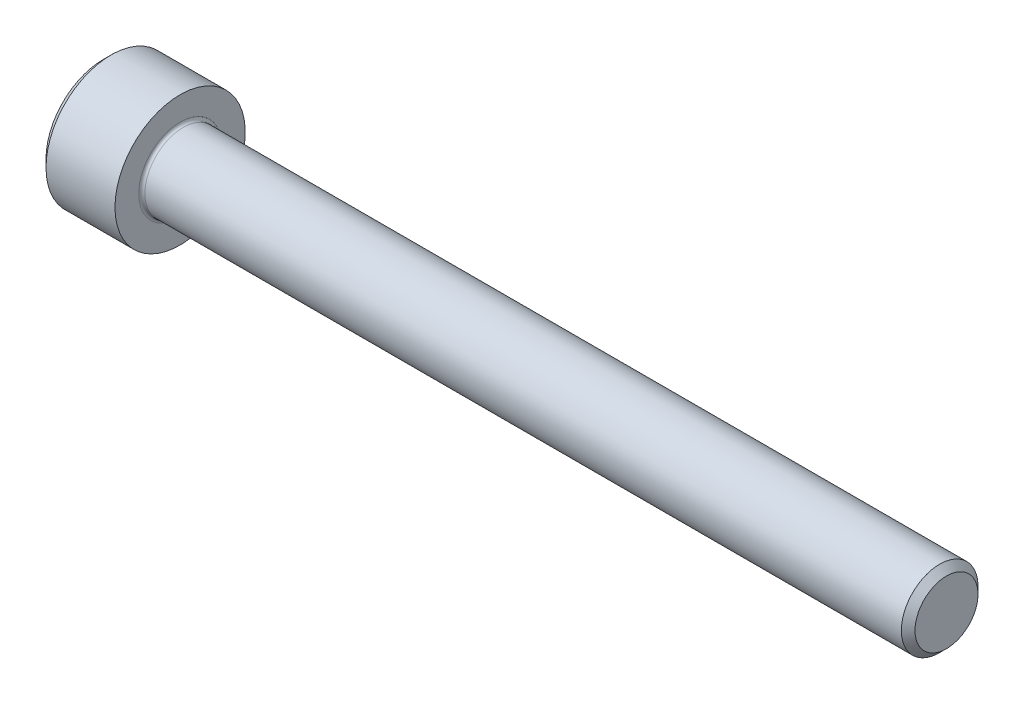
ISO-10303-21;
HEADER;
FILE_DESCRIPTION(('STEP AP214'),'2;1');
FILE_NAME('part.step','',(''),(''),'','','');
FILE_SCHEMA(('AUTOMOTIVE_DESIGN { 1 0 10303 214 1 1 1 1 }'));
ENDSEC;
DATA;
#1=APPLICATION_CONTEXT('core data for automotive mechanical design processes');
#2=APPLICATION_PROTOCOL_DEFINITION('international standard','automotive_design',2000,#1);
#3=PRODUCT_CONTEXT('',#1,'mechanical');
#4=PRODUCT('Part','Part','',(#3));
#5=PRODUCT_RELATED_PRODUCT_CATEGORY('part','',(#4));
#6=PRODUCT_DEFINITION_FORMATION('','',#4);
#7=PRODUCT_DEFINITION_CONTEXT('part definition',#1,'design');
#8=PRODUCT_DEFINITION('design','',#6,#7);
#9=PRODUCT_DEFINITION_SHAPE('','',#8);
#10=(LENGTH_UNIT() NAMED_UNIT(*) SI_UNIT(.MILLI.,.METRE.));
#11=(NAMED_UNIT(*) PLANE_ANGLE_UNIT() SI_UNIT($,.RADIAN.));
#12=(NAMED_UNIT(*) SI_UNIT($,.STERADIAN.) SOLID_ANGLE_UNIT());
#13=UNCERTAINTY_MEASURE_WITH_UNIT(LENGTH_MEASURE(1.E-05),#10,'distance_accuracy_value','');
#14=(GEOMETRIC_REPRESENTATION_CONTEXT(3) GLOBAL_UNCERTAINTY_ASSIGNED_CONTEXT((#13)) GLOBAL_UNIT_ASSIGNED_CONTEXT((#10,
#11,#12)) REPRESENTATION_CONTEXT('',''));
#15=CARTESIAN_POINT('',(0.,0.,0.));
#16=DIRECTION('',(0.,0.,1.));
#17=DIRECTION('',(1.,0.,0.));
#18=AXIS2_PLACEMENT_3D('',#15,#16,#17);
#19=CARTESIAN_POINT('',(0.,0.,0.));
#20=DIRECTION('',(-1.,0.,0.));
#21=DIRECTION('',(0.,0.,1.));
#22=AXIS2_PLACEMENT_3D('',#19,#20,#21);
#23=PLANE('',#22);
#24=DIRECTION('',(0.,-0.499999999999999,0.866025403784439));
#25=VECTOR('',#24,1.);
#26=CARTESIAN_POINT('',(0.,2.35789849937043,0.));
#27=LINE('',#26,#25);
#28=CARTESIAN_POINT('',(0.,2.35789849937043,0.));
#29=VERTEX_POINT('',#28);
#30=CARTESIAN_POINT('',(0.,1.17894924968522,2.042));
#31=VERTEX_POINT('',#30);
#32=EDGE_CURVE('E293',#29,#31,#27,.T.);
#33=ORIENTED_EDGE('',*,*,#32,.T.);
#34=DIRECTION('',(0.,1.,0.));
#35=VECTOR('',#34,1.);
#36=CARTESIAN_POINT('',(0.,-1.17894924968522,2.042));
#37=LINE('',#36,#35);
#38=CARTESIAN_POINT('',(0.,-1.17894924968522,2.042));
#39=VERTEX_POINT('',#38);
#40=EDGE_CURVE('E136',#39,#31,#37,.T.);
#41=ORIENTED_EDGE('',*,*,#40,.F.);
#42=DIRECTION('',(0.,-0.500000000000001,-0.866025403784438));
#43=VECTOR('',#42,1.);
#44=CARTESIAN_POINT('',(0.,-1.17894924968522,2.042));
#45=LINE('',#44,#43);
#46=CARTESIAN_POINT('',(0.,-2.35789849937043,0.));
#47=VERTEX_POINT('',#46);
#48=EDGE_CURVE('E298',#39,#47,#45,.T.);
#49=ORIENTED_EDGE('',*,*,#48,.T.);
#50=DIRECTION('',(0.,0.499999999999999,-0.866025403784439));
#51=VECTOR('',#50,1.);
#52=CARTESIAN_POINT('',(0.,-2.35789849937043,0.));
#53=LINE('',#52,#51);
#54=CARTESIAN_POINT('',(0.,-1.17894924968522,-2.042));
#55=VERTEX_POINT('',#54);
#56=EDGE_CURVE('E302',#47,#55,#53,.T.);
#57=ORIENTED_EDGE('',*,*,#56,.T.);
#58=DIRECTION('',(0.,-1.,0.));
#59=VECTOR('',#58,1.);
#60=CARTESIAN_POINT('',(0.,1.17894924968521,-2.042));
#61=LINE('',#60,#59);
#62=CARTESIAN_POINT('',(0.,1.17894924968521,-2.042));
#63=VERTEX_POINT('',#62);
#64=EDGE_CURVE('E306',#63,#55,#61,.T.);
#65=ORIENTED_EDGE('',*,*,#64,.F.);
#66=DIRECTION('',(0.,-0.500000000000001,-0.866025403784438));
#67=VECTOR('',#66,1.);
#68=CARTESIAN_POINT('',(0.,2.35789849937043,0.));
#69=LINE('',#68,#67);
#70=EDGE_CURVE('E131',#29,#63,#69,.T.);
#71=ORIENTED_EDGE('',*,*,#70,.F.);
#72=EDGE_LOOP('',(#33,#41,#49,#57,#65,#71));
#73=FACE_BOUND('',#72,.T.);
#74=CARTESIAN_POINT('',(0.,0.,0.));
#75=DIRECTION('',(-1.,0.,0.));
#76=DIRECTION('',(0.,0.,1.));
#77=AXIS2_PLACEMENT_3D('',#74,#75,#76);
#78=CIRCLE('',#77,3.75);
#79=CARTESIAN_POINT('',(0.,0.,3.75));
#80=VERTEX_POINT('',#79);
#81=EDGE_CURVE('E168',#80,#80,#78,.T.);
#82=ORIENTED_EDGE('',*,*,#81,.T.);
#83=EDGE_LOOP('',(#82));
#84=FACE_BOUND('',#83,.T.);
#85=ADVANCED_FACE('F41',(#73,#84),#23,.T.);
#86=CARTESIAN_POINT('',(0.,0.,0.));
#87=DIRECTION('',(1.,0.,0.));
#88=DIRECTION('',(0.,0.,-1.));
#89=AXIS2_PLACEMENT_3D('',#86,#87,#88);
#90=CONICAL_SURFACE('',#89,3.75,0.785398163397449);
#91=CARTESIAN_POINT('',(0.5,0.,0.));
#92=DIRECTION('',(-1.,0.,0.));
#93=DIRECTION('',(0.,0.,1.));
#94=AXIS2_PLACEMENT_3D('',#91,#92,#93);
#95=CIRCLE('',#94,4.25);
#96=CARTESIAN_POINT('',(0.5,0.,4.25));
#97=VERTEX_POINT('',#96);
#98=EDGE_CURVE('E164',#97,#97,#95,.T.);
#99=ORIENTED_EDGE('',*,*,#98,.T.);
#100=EDGE_LOOP('',(#99));
#101=FACE_BOUND('',#100,.T.);
#102=ORIENTED_EDGE('',*,*,#81,.F.);
#103=EDGE_LOOP('',(#102));
#104=FACE_BOUND('',#103,.T.);
#105=ADVANCED_FACE('F191',(#101,#104),#90,.T.);
#106=CARTESIAN_POINT('',(-31.75,0.,0.));
#107=DIRECTION('',(-1.,0.,0.));
#108=DIRECTION('',(0.,0.,1.));
#109=AXIS2_PLACEMENT_3D('',#106,#107,#108);
#110=CYLINDRICAL_SURFACE('',#109,4.25);
#111=CARTESIAN_POINT('',(5.,0.,0.));
#112=DIRECTION('',(-1.,0.,0.));
#113=DIRECTION('',(0.,0.,1.));
#114=AXIS2_PLACEMENT_3D('',#111,#112,#113);
#115=CIRCLE('',#114,4.25);
#116=CARTESIAN_POINT('',(5.,0.,4.25));
#117=VERTEX_POINT('',#116);
#118=EDGE_CURVE('E160',#117,#117,#115,.T.);
#119=ORIENTED_EDGE('',*,*,#118,.T.);
#120=EDGE_LOOP('',(#119));
#121=FACE_BOUND('',#120,.T.);
#122=ORIENTED_EDGE('',*,*,#98,.F.);
#123=EDGE_LOOP('',(#122));
#124=FACE_BOUND('',#123,.T.);
#125=ADVANCED_FACE('F196',(#121,#124),#110,.T.);
#126=CARTESIAN_POINT('',(5.,4.25,0.));
#127=DIRECTION('',(1.,0.,0.));
#128=DIRECTION('',(0.,0.,-1.));
#129=AXIS2_PLACEMENT_3D('',#126,#127,#128);
#130=PLANE('',#129);
#131=CARTESIAN_POINT('',(5.,0.,0.));
#132=DIRECTION('',(1.,0.,0.));
#133=DIRECTION('',(0.,0.,-1.));
#134=AXIS2_PLACEMENT_3D('',#131,#132,#133);
#135=CIRCLE('',#134,2.69999999999998);
#136=CARTESIAN_POINT('',(5.,0.,-2.69999999999998));
#137=VERTEX_POINT('',#136);
#138=EDGE_CURVE('E50',#137,#137,#135,.F.);
#139=ORIENTED_EDGE('',*,*,#138,.T.);
#140=EDGE_LOOP('',(#139));
#141=FACE_BOUND('',#140,.T.);
#142=ORIENTED_EDGE('',*,*,#118,.F.);
#143=EDGE_LOOP('',(#142));
#144=FACE_BOUND('',#143,.T.);
#145=ADVANCED_FACE('F175',(#141,#144),#130,.T.);
#146=CARTESIAN_POINT('',(-31.75,0.,0.));
#147=DIRECTION('',(-1.,0.,0.));
#148=DIRECTION('',(0.,0.,1.));
#149=AXIS2_PLACEMENT_3D('',#146,#147,#148);
#150=CYLINDRICAL_SURFACE('',#149,2.49999999999998);
#151=CARTESIAN_POINT('',(5.2,0.,0.));
#152=DIRECTION('',(1.,0.,0.));
#153=DIRECTION('',(0.,0.,-1.));
#154=AXIS2_PLACEMENT_3D('',#151,#152,#153);
#155=CIRCLE('',#154,2.49999999999998);
#156=CARTESIAN_POINT('',(5.2,0.,-2.49999999999998));
#157=VERTEX_POINT('',#156);
#158=EDGE_CURVE('E11',#157,#157,#155,.T.);
#159=ORIENTED_EDGE('',*,*,#158,.T.);
#160=EDGE_LOOP('',(#159));
#161=FACE_BOUND('',#160,.T.);
#162=CARTESIAN_POINT('',(54.555,0.,0.));
#163=DIRECTION('',(-1.,0.,0.));
#164=DIRECTION('',(0.,0.,1.));
#165=AXIS2_PLACEMENT_3D('',#162,#163,#164);
#166=CIRCLE('',#165,2.49999999999996);
#167=CARTESIAN_POINT('',(54.555,0.,2.49999999999996));
#168=VERTEX_POINT('',#167);
#169=EDGE_CURVE('E156',#168,#168,#166,.T.);
#170=ORIENTED_EDGE('',*,*,#169,.T.);
#171=EDGE_LOOP('',(#170));
#172=FACE_BOUND('',#171,.T.);
#173=ADVANCED_FACE('F206',(#161,#172),#150,.T.);
#174=CARTESIAN_POINT('',(55.,0.,0.));
#175=DIRECTION('',(-1.,0.,0.));
#176=DIRECTION('',(0.,0.,1.));
#177=AXIS2_PLACEMENT_3D('',#174,#175,#176);
#178=CONICAL_SURFACE('',#177,2.055,0.785398163397367);
#179=ORIENTED_EDGE('',*,*,#169,.F.);
#180=EDGE_LOOP('',(#179));
#181=FACE_BOUND('',#180,.T.);
#182=CARTESIAN_POINT('',(55.,0.,0.));
#183=DIRECTION('',(-1.,0.,0.));
#184=DIRECTION('',(0.,0.,1.));
#185=AXIS2_PLACEMENT_3D('',#182,#183,#184);
#186=CIRCLE('',#185,2.055);
#187=CARTESIAN_POINT('',(55.,0.,2.055));
#188=VERTEX_POINT('',#187);
#189=EDGE_CURVE('E151',#188,#188,#186,.T.);
#190=ORIENTED_EDGE('',*,*,#189,.T.);
#191=EDGE_LOOP('',(#190));
#192=FACE_BOUND('',#191,.T.);
#193=ADVANCED_FACE('F186',(#181,#192),#178,.T.);
#194=CARTESIAN_POINT('',(55.,2.055,0.));
#195=DIRECTION('',(1.,0.,0.));
#196=DIRECTION('',(0.,0.,-1.));
#197=AXIS2_PLACEMENT_3D('',#194,#195,#196);
#198=PLANE('',#197);
#199=ORIENTED_EDGE('',*,*,#189,.F.);
#200=EDGE_LOOP('',(#199));
#201=FACE_BOUND('',#200,.T.);
#202=ADVANCED_FACE('F179',(#201),#198,.T.);
#203=CARTESIAN_POINT('',(5.2,0.,0.));
#204=DIRECTION('',(1.,0.,0.));
#205=DIRECTION('',(0.,0.,-1.));
#206=AXIS2_PLACEMENT_3D('',#203,#204,#205);
#207=TOROIDAL_SURFACE('',#206,2.69999999999998,0.2);
#208=ORIENTED_EDGE('',*,*,#158,.F.);
#209=EDGE_LOOP('',(#208));
#210=FACE_BOUND('',#209,.T.);
#211=ORIENTED_EDGE('',*,*,#138,.F.);
#212=EDGE_LOOP('',(#211));
#213=FACE_BOUND('',#212,.T.);
#214=ADVANCED_FACE('F43',(#210,#213),#207,.F.);
#215=CARTESIAN_POINT('',(2.5,2.35789849937043,0.));
#216=DIRECTION('',(0.,-0.866025403784439,-0.499999999999999));
#217=DIRECTION('',(0.,0.499999999999999,-0.86602540378444));
#218=AXIS2_PLACEMENT_3D('',#215,#216,#217);
#219=PLANE('',#218);
#220=ORIENTED_EDGE('',*,*,#32,.F.);
#221=DIRECTION('',(-1.,0.,0.));
#222=VECTOR('',#221,1.);
#223=CARTESIAN_POINT('',(2.5,2.35789849937043,0.));
#224=LINE('',#223,#222);
#225=CARTESIAN_POINT('',(2.5,2.35789849937043,0.));
#226=VERTEX_POINT('',#225);
#227=EDGE_CURVE('E292',#226,#29,#224,.T.);
#228=ORIENTED_EDGE('',*,*,#227,.F.);
#229=DIRECTION('',(0.,-0.499999999999999,0.866025403784439));
#230=VECTOR('',#229,1.);
#231=CARTESIAN_POINT('',(2.5,2.35789849937043,0.));
#232=LINE('',#231,#230);
#233=CARTESIAN_POINT('',(2.5,1.76842387452783,1.021));
#234=VERTEX_POINT('',#233);
#235=EDGE_CURVE('E57',#226,#234,#232,.T.);
#236=ORIENTED_EDGE('',*,*,#235,.T.);
#237=CARTESIAN_POINT('',(2.5,1.17894924968522,2.042));
#238=VERTEX_POINT('',#237);
#239=EDGE_CURVE('E115',#234,#238,#232,.T.);
#240=ORIENTED_EDGE('',*,*,#239,.T.);
#241=DIRECTION('',(-1.,0.,0.));
#242=VECTOR('',#241,1.);
#243=CARTESIAN_POINT('',(2.5,1.17894924968522,2.042));
#244=LINE('',#243,#242);
#245=EDGE_CURVE('E128',#238,#31,#244,.T.);
#246=ORIENTED_EDGE('',*,*,#245,.T.);
#247=EDGE_LOOP('',(#220,#228,#236,#240,#246));
#248=FACE_BOUND('',#247,.T.);
#249=ADVANCED_FACE('F127',(#248),#219,.T.);
#250=CARTESIAN_POINT('',(2.5,-1.17894924968522,2.042));
#251=DIRECTION('',(0.,0.,1.));
#252=DIRECTION('',(0.,-1.,0.));
#253=AXIS2_PLACEMENT_3D('',#250,#251,#252);
#254=PLANE('',#253);
#255=ORIENTED_EDGE('',*,*,#40,.T.);
#256=ORIENTED_EDGE('',*,*,#245,.F.);
#257=DIRECTION('',(0.,1.,0.));
#258=VECTOR('',#257,1.);
#259=CARTESIAN_POINT('',(2.5,-1.17894924968522,2.042));
#260=LINE('',#259,#258);
#261=CARTESIAN_POINT('',(2.5,0.,2.042));
#262=VERTEX_POINT('',#261);
#263=EDGE_CURVE('E113',#262,#238,#260,.T.);
#264=ORIENTED_EDGE('',*,*,#263,.F.);
#265=CARTESIAN_POINT('',(2.5,-1.17894924968522,2.042));
#266=VERTEX_POINT('',#265);
#267=EDGE_CURVE('E124',#266,#262,#260,.T.);
#268=ORIENTED_EDGE('',*,*,#267,.F.);
#269=DIRECTION('',(-1.,0.,0.));
#270=VECTOR('',#269,1.);
#271=CARTESIAN_POINT('',(2.5,-1.17894924968522,2.042));
#272=LINE('',#271,#270);
#273=EDGE_CURVE('E139',#266,#39,#272,.T.);
#274=ORIENTED_EDGE('',*,*,#273,.T.);
#275=EDGE_LOOP('',(#255,#256,#264,#268,#274));
#276=FACE_BOUND('',#275,.T.);
#277=ADVANCED_FACE('F133',(#276),#254,.F.);
#278=CARTESIAN_POINT('',(2.5,-1.17894924968522,2.042));
#279=DIRECTION('',(0.,0.866025403784438,-0.500000000000001));
#280=DIRECTION('',(0.,0.500000000000001,0.866025403784438));
#281=AXIS2_PLACEMENT_3D('',#278,#279,#280);
#282=PLANE('',#281);
#283=ORIENTED_EDGE('',*,*,#48,.F.);
#284=ORIENTED_EDGE('',*,*,#273,.F.);
#285=DIRECTION('',(0.,-0.500000000000001,-0.866025403784438));
#286=VECTOR('',#285,1.);
#287=CARTESIAN_POINT('',(2.5,-1.17894924968522,2.042));
#288=LINE('',#287,#286);
#289=CARTESIAN_POINT('',(2.5,-1.76842387452782,1.021));
#290=VERTEX_POINT('',#289);
#291=EDGE_CURVE('E267',#266,#290,#288,.T.);
#292=ORIENTED_EDGE('',*,*,#291,.T.);
#293=CARTESIAN_POINT('',(2.5,-2.35789849937043,0.));
#294=VERTEX_POINT('',#293);
#295=EDGE_CURVE('E269',#290,#294,#288,.T.);
#296=ORIENTED_EDGE('',*,*,#295,.T.);
#297=DIRECTION('',(-1.,0.,0.));
#298=VECTOR('',#297,1.);
#299=CARTESIAN_POINT('',(2.5,-2.35789849937043,0.));
#300=LINE('',#299,#298);
#301=EDGE_CURVE('E146',#294,#47,#300,.T.);
#302=ORIENTED_EDGE('',*,*,#301,.T.);
#303=EDGE_LOOP('',(#283,#284,#292,#296,#302));
#304=FACE_BOUND('',#303,.T.);
#305=ADVANCED_FACE('F218',(#304),#282,.T.);
#306=CARTESIAN_POINT('',(2.5,-2.35789849937043,0.));
#307=DIRECTION('',(0.,0.866025403784439,0.499999999999999));
#308=DIRECTION('',(0.,-0.499999999999999,0.866025403784439));
#309=AXIS2_PLACEMENT_3D('',#306,#307,#308);
#310=PLANE('',#309);
#311=ORIENTED_EDGE('',*,*,#56,.F.);
#312=ORIENTED_EDGE('',*,*,#301,.F.);
#313=DIRECTION('',(0.,0.499999999999999,-0.866025403784439));
#314=VECTOR('',#313,1.);
#315=CARTESIAN_POINT('',(2.5,-2.35789849937043,0.));
#316=LINE('',#315,#314);
#317=CARTESIAN_POINT('',(2.5,-1.76842387452783,-1.021));
#318=VERTEX_POINT('',#317);
#319=EDGE_CURVE('E272',#294,#318,#316,.T.);
#320=ORIENTED_EDGE('',*,*,#319,.T.);
#321=CARTESIAN_POINT('',(2.5,-1.17894924968522,-2.042));
#322=VERTEX_POINT('',#321);
#323=EDGE_CURVE('E278',#318,#322,#316,.T.);
#324=ORIENTED_EDGE('',*,*,#323,.T.);
#325=DIRECTION('',(-1.,0.,0.));
#326=VECTOR('',#325,1.);
#327=CARTESIAN_POINT('',(2.5,-1.17894924968522,-2.042));
#328=LINE('',#327,#326);
#329=EDGE_CURVE('E319',#322,#55,#328,.T.);
#330=ORIENTED_EDGE('',*,*,#329,.T.);
#331=EDGE_LOOP('',(#311,#312,#320,#324,#330));
#332=FACE_BOUND('',#331,.T.);
#333=ADVANCED_FACE('F221',(#332),#310,.T.);
#334=CARTESIAN_POINT('',(2.5,1.17894924968521,-2.042));
#335=DIRECTION('',(0.,0.,-1.));
#336=DIRECTION('',(0.,1.,0.));
#337=AXIS2_PLACEMENT_3D('',#334,#335,#336);
#338=PLANE('',#337);
#339=ORIENTED_EDGE('',*,*,#64,.T.);
#340=ORIENTED_EDGE('',*,*,#329,.F.);
#341=DIRECTION('',(0.,-1.,0.));
#342=VECTOR('',#341,1.);
#343=CARTESIAN_POINT('',(2.5,1.17894924968521,-2.042));
#344=LINE('',#343,#342);
#345=CARTESIAN_POINT('',(2.5,0.,-2.042));
#346=VERTEX_POINT('',#345);
#347=EDGE_CURVE('E284',#346,#322,#344,.T.);
#348=ORIENTED_EDGE('',*,*,#347,.F.);
#349=CARTESIAN_POINT('',(2.5,1.17894924968521,-2.042));
#350=VERTEX_POINT('',#349);
#351=EDGE_CURVE('E285',#350,#346,#344,.T.);
#352=ORIENTED_EDGE('',*,*,#351,.F.);
#353=DIRECTION('',(-1.,0.,0.));
#354=VECTOR('',#353,1.);
#355=CARTESIAN_POINT('',(2.5,1.17894924968521,-2.042));
#356=LINE('',#355,#354);
#357=EDGE_CURVE('E315',#350,#63,#356,.T.);
#358=ORIENTED_EDGE('',*,*,#357,.T.);
#359=EDGE_LOOP('',(#339,#340,#348,#352,#358));
#360=FACE_BOUND('',#359,.T.);
#361=ADVANCED_FACE('F225',(#360),#338,.F.);
#362=CARTESIAN_POINT('',(2.5,2.35789849937043,0.));
#363=DIRECTION('',(0.,0.866025403784438,-0.500000000000001));
#364=DIRECTION('',(0.,0.500000000000001,0.866025403784438));
#365=AXIS2_PLACEMENT_3D('',#362,#363,#364);
#366=PLANE('',#365);
#367=ORIENTED_EDGE('',*,*,#70,.T.);
#368=ORIENTED_EDGE('',*,*,#357,.F.);
#369=DIRECTION('',(0.,-0.500000000000001,-0.866025403784438));
#370=VECTOR('',#369,1.);
#371=CARTESIAN_POINT('',(2.5,2.35789849937043,0.));
#372=LINE('',#371,#370);
#373=CARTESIAN_POINT('',(2.5,1.76842387452782,-1.021));
#374=VERTEX_POINT('',#373);
#375=EDGE_CURVE('E289',#374,#350,#372,.T.);
#376=ORIENTED_EDGE('',*,*,#375,.F.);
#377=EDGE_CURVE('E257',#226,#374,#372,.T.);
#378=ORIENTED_EDGE('',*,*,#377,.F.);
#379=ORIENTED_EDGE('',*,*,#227,.T.);
#380=EDGE_LOOP('',(#367,#368,#376,#378,#379));
#381=FACE_BOUND('',#380,.T.);
#382=ADVANCED_FACE('F229',(#381),#366,.F.);
#383=CARTESIAN_POINT('',(2.5,1.17894924968522,2.042));
#384=DIRECTION('',(-1.,0.,0.));
#385=DIRECTION('',(0.,0.,1.));
#386=AXIS2_PLACEMENT_3D('',#383,#384,#385);
#387=PLANE('',#386);
#388=CARTESIAN_POINT('',(2.5,0.,0.));
#389=DIRECTION('',(-1.,0.,0.));
#390=DIRECTION('',(0.,0.,1.));
#391=AXIS2_PLACEMENT_3D('',#388,#389,#390);
#392=CIRCLE('',#391,2.042);
#393=EDGE_CURVE('E138',#290,#262,#392,.T.);
#394=ORIENTED_EDGE('',*,*,#393,.F.);
#395=ORIENTED_EDGE('',*,*,#291,.F.);
#396=ORIENTED_EDGE('',*,*,#267,.T.);
#397=EDGE_LOOP('',(#394,#395,#396));
#398=FACE_BOUND('',#397,.T.);
#399=ADVANCED_FACE('F233',(#398),#387,.T.);
#400=EDGE_CURVE('E144',#318,#290,#392,.T.);
#401=ORIENTED_EDGE('',*,*,#400,.F.);
#402=ORIENTED_EDGE('',*,*,#319,.F.);
#403=ORIENTED_EDGE('',*,*,#295,.F.);
#404=EDGE_LOOP('',(#401,#402,#403));
#405=FACE_BOUND('',#404,.T.);
#406=ADVANCED_FACE('F236',(#405),#387,.T.);
#407=EDGE_CURVE('E331',#346,#318,#392,.T.);
#408=ORIENTED_EDGE('',*,*,#407,.F.);
#409=ORIENTED_EDGE('',*,*,#347,.T.);
#410=ORIENTED_EDGE('',*,*,#323,.F.);
#411=EDGE_LOOP('',(#408,#409,#410));
#412=FACE_BOUND('',#411,.T.);
#413=ADVANCED_FACE('F241',(#412),#387,.T.);
#414=EDGE_CURVE('E261',#374,#346,#392,.T.);
#415=ORIENTED_EDGE('',*,*,#414,.F.);
#416=ORIENTED_EDGE('',*,*,#375,.T.);
#417=ORIENTED_EDGE('',*,*,#351,.T.);
#418=EDGE_LOOP('',(#415,#416,#417));
#419=FACE_BOUND('',#418,.T.);
#420=ADVANCED_FACE('F248',(#419),#387,.T.);
#421=EDGE_CURVE('E152',#234,#374,#392,.T.);
#422=ORIENTED_EDGE('',*,*,#421,.F.);
#423=ORIENTED_EDGE('',*,*,#235,.F.);
#424=ORIENTED_EDGE('',*,*,#377,.T.);
#425=EDGE_LOOP('',(#422,#423,#424));
#426=FACE_BOUND('',#425,.T.);
#427=ADVANCED_FACE('F244',(#426),#387,.T.);
#428=EDGE_CURVE('E118',#262,#234,#392,.T.);
#429=ORIENTED_EDGE('',*,*,#428,.F.);
#430=ORIENTED_EDGE('',*,*,#263,.T.);
#431=ORIENTED_EDGE('',*,*,#239,.F.);
#432=EDGE_LOOP('',(#429,#430,#431));
#433=FACE_BOUND('',#432,.T.);
#434=ADVANCED_FACE('F114',(#433),#387,.T.);
#435=CARTESIAN_POINT('',(2.5,0.,0.));
#436=DIRECTION('',(-1.,0.,0.));
#437=DIRECTION('',(0.,0.,1.));
#438=AXIS2_PLACEMENT_3D('',#435,#436,#437);
#439=CONICAL_SURFACE('',#438,2.042,1.04719755119659);
#440=CARTESIAN_POINT('',(3.67894924968523,0.,0.));
#441=VERTEX_POINT('',#440);
#442=VERTEX_LOOP('',#441);
#443=FACE_BOUND('',#442,.T.);
#444=ORIENTED_EDGE('',*,*,#428,.T.);
#445=ORIENTED_EDGE('',*,*,#421,.T.);
#446=ORIENTED_EDGE('',*,*,#414,.T.);
#447=ORIENTED_EDGE('',*,*,#407,.T.);
#448=ORIENTED_EDGE('',*,*,#400,.T.);
#449=ORIENTED_EDGE('',*,*,#393,.T.);
#450=EDGE_LOOP('',(#444,#445,#446,#447,#448,#449));
#451=FACE_BOUND('',#450,.T.);
#452=ADVANCED_FACE('F213',(#443,#451),#439,.F.);
#453=CLOSED_SHELL('',(#85,#105,#125,#145,#173,#193,#202,#214,#249,#277,#305,#333,#361,#382,#399,
#406,#413,#420,#427,#434,#452));
#454=MANIFOLD_SOLID_BREP('B2',#453);
#455=ADVANCED_BREP_SHAPE_REPRESENTATION('',(#18,#454),#14);
#456=SHAPE_DEFINITION_REPRESENTATION(#9,#455);
ENDSEC;
END-ISO-10303-21;
